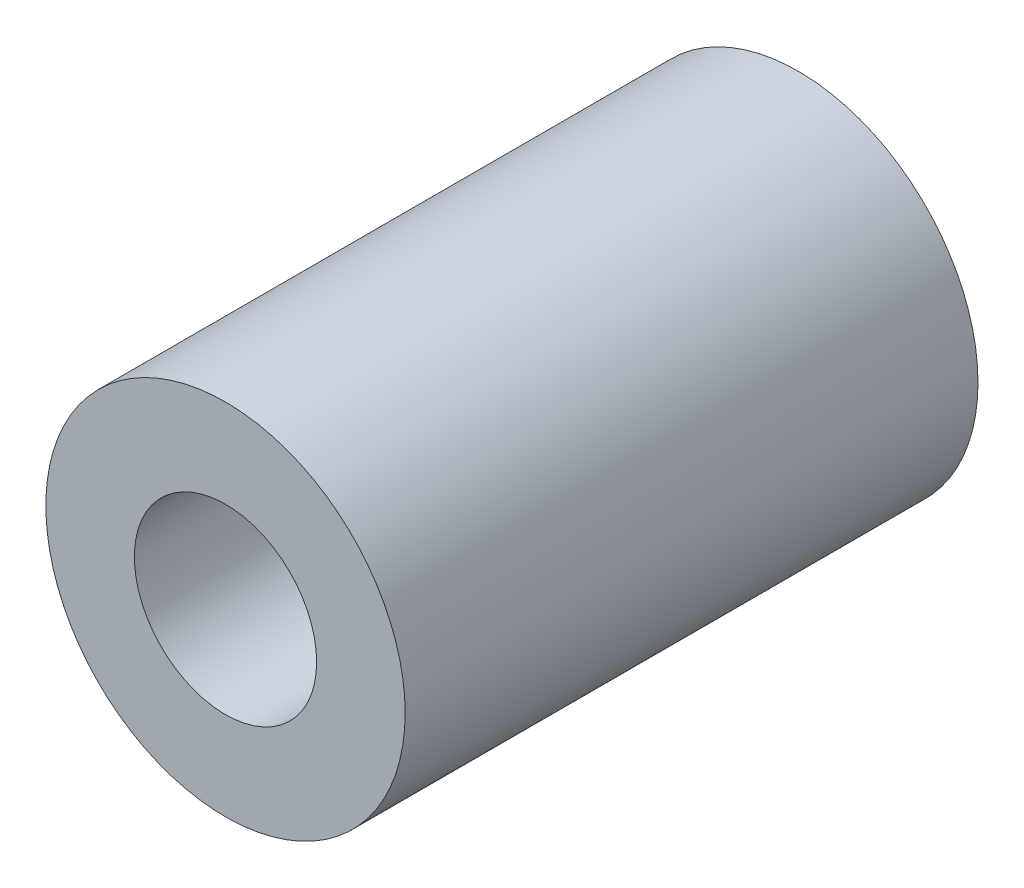
ISO-10303-21;
HEADER;
FILE_DESCRIPTION(('STEP AP214'),'2;1');
FILE_NAME('part.step','',(''),(''),'','','');
FILE_SCHEMA(('AUTOMOTIVE_DESIGN { 1 0 10303 214 1 1 1 1 }'));
ENDSEC;
DATA;
#1=APPLICATION_CONTEXT('core data for automotive mechanical design processes');
#2=APPLICATION_PROTOCOL_DEFINITION('international standard','automotive_design',2000,#1);
#3=PRODUCT_CONTEXT('',#1,'mechanical');
#4=PRODUCT('Part','Part','',(#3));
#5=PRODUCT_RELATED_PRODUCT_CATEGORY('part','',(#4));
#6=PRODUCT_DEFINITION_FORMATION('','',#4);
#7=PRODUCT_DEFINITION_CONTEXT('part definition',#1,'design');
#8=PRODUCT_DEFINITION('design','',#6,#7);
#9=PRODUCT_DEFINITION_SHAPE('','',#8);
#10=(LENGTH_UNIT() NAMED_UNIT(*) SI_UNIT(.MILLI.,.METRE.));
#11=(NAMED_UNIT(*) PLANE_ANGLE_UNIT() SI_UNIT($,.RADIAN.));
#12=(NAMED_UNIT(*) SI_UNIT($,.STERADIAN.) SOLID_ANGLE_UNIT());
#13=UNCERTAINTY_MEASURE_WITH_UNIT(LENGTH_MEASURE(1.E-05),#10,'distance_accuracy_value','');
#14=(GEOMETRIC_REPRESENTATION_CONTEXT(3) GLOBAL_UNCERTAINTY_ASSIGNED_CONTEXT((#13)) GLOBAL_UNIT_ASSIGNED_CONTEXT((#10,
#11,#12)) REPRESENTATION_CONTEXT('',''));
#15=CARTESIAN_POINT('',(0.,0.,0.));
#16=DIRECTION('',(0.,0.,1.));
#17=DIRECTION('',(1.,0.,0.));
#18=AXIS2_PLACEMENT_3D('',#15,#16,#17);
#19=CARTESIAN_POINT('',(0.,0.,11.));
#20=DIRECTION('',(0.,0.,1.));
#21=DIRECTION('',(1.,0.,0.));
#22=AXIS2_PLACEMENT_3D('',#19,#20,#21);
#23=PLANE('',#22);
#24=CARTESIAN_POINT('',(0.,0.,11.));
#25=DIRECTION('',(0.,0.,1.));
#26=DIRECTION('',(1.,0.,0.));
#27=AXIS2_PLACEMENT_3D('',#24,#25,#26);
#28=CIRCLE('',#27,3.45);
#29=CARTESIAN_POINT('',(3.45,0.,11.));
#30=VERTEX_POINT('',#29);
#31=EDGE_CURVE('E10',#30,#30,#28,.T.);
#32=ORIENTED_EDGE('',*,*,#31,.T.);
#33=EDGE_LOOP('',(#32));
#34=FACE_BOUND('',#33,.T.);
#35=CARTESIAN_POINT('',(0.,0.,11.));
#36=DIRECTION('',(0.,0.,1.));
#37=DIRECTION('',(1.,0.,0.));
#38=AXIS2_PLACEMENT_3D('',#35,#36,#37);
#39=CIRCLE('',#38,1.75);
#40=CARTESIAN_POINT('',(1.75,0.,11.));
#41=VERTEX_POINT('',#40);
#42=EDGE_CURVE('E56',#41,#41,#39,.T.);
#43=ORIENTED_EDGE('',*,*,#42,.F.);
#44=EDGE_LOOP('',(#43));
#45=FACE_BOUND('',#44,.T.);
#46=ADVANCED_FACE('F43',(#34,#45),#23,.T.);
#47=CARTESIAN_POINT('',(0.,0.,0.));
#48=DIRECTION('',(0.,0.,1.));
#49=DIRECTION('',(1.,0.,0.));
#50=AXIS2_PLACEMENT_3D('',#47,#48,#49);
#51=PLANE('',#50);
#52=CARTESIAN_POINT('',(0.,0.,0.));
#53=DIRECTION('',(0.,0.,1.));
#54=DIRECTION('',(1.,0.,0.));
#55=AXIS2_PLACEMENT_3D('',#52,#53,#54);
#56=CIRCLE('',#55,3.45);
#57=CARTESIAN_POINT('',(3.45,0.,0.));
#58=VERTEX_POINT('',#57);
#59=EDGE_CURVE('E47',#58,#58,#56,.T.);
#60=ORIENTED_EDGE('',*,*,#59,.F.);
#61=EDGE_LOOP('',(#60));
#62=FACE_BOUND('',#61,.T.);
#63=CARTESIAN_POINT('',(0.,0.,0.));
#64=DIRECTION('',(0.,0.,1.));
#65=DIRECTION('',(1.,0.,0.));
#66=AXIS2_PLACEMENT_3D('',#63,#64,#65);
#67=CIRCLE('',#66,1.75);
#68=CARTESIAN_POINT('',(1.75,0.,0.));
#69=VERTEX_POINT('',#68);
#70=EDGE_CURVE('E58',#69,#69,#67,.T.);
#71=ORIENTED_EDGE('',*,*,#70,.T.);
#72=EDGE_LOOP('',(#71));
#73=FACE_BOUND('',#72,.T.);
#74=ADVANCED_FACE('F70',(#62,#73),#51,.F.);
#75=CARTESIAN_POINT('',(0.,0.,11.));
#76=DIRECTION('',(0.,0.,-1.));
#77=DIRECTION('',(-1.,0.,0.));
#78=AXIS2_PLACEMENT_3D('',#75,#76,#77);
#79=CYLINDRICAL_SURFACE('',#78,3.45);
#80=ORIENTED_EDGE('',*,*,#31,.F.);
#81=EDGE_LOOP('',(#80));
#82=FACE_BOUND('',#81,.T.);
#83=ORIENTED_EDGE('',*,*,#59,.T.);
#84=EDGE_LOOP('',(#83));
#85=FACE_BOUND('',#84,.T.);
#86=ADVANCED_FACE('F45',(#82,#85),#79,.T.);
#87=CARTESIAN_POINT('',(0.,0.,11.));
#88=DIRECTION('',(0.,0.,-1.));
#89=DIRECTION('',(-1.,0.,0.));
#90=AXIS2_PLACEMENT_3D('',#87,#88,#89);
#91=CYLINDRICAL_SURFACE('',#90,1.75);
#92=ORIENTED_EDGE('',*,*,#42,.T.);
#93=EDGE_LOOP('',(#92));
#94=FACE_BOUND('',#93,.T.);
#95=ORIENTED_EDGE('',*,*,#70,.F.);
#96=EDGE_LOOP('',(#95));
#97=FACE_BOUND('',#96,.T.);
#98=ADVANCED_FACE('F66',(#94,#97),#91,.F.);
#99=CLOSED_SHELL('',(#46,#74,#86,#98));
#100=MANIFOLD_SOLID_BREP('B2',#99);
#101=ADVANCED_BREP_SHAPE_REPRESENTATION('',(#18,#100),#14);
#102=SHAPE_DEFINITION_REPRESENTATION(#9,#101);
ENDSEC;
END-ISO-10303-21;
